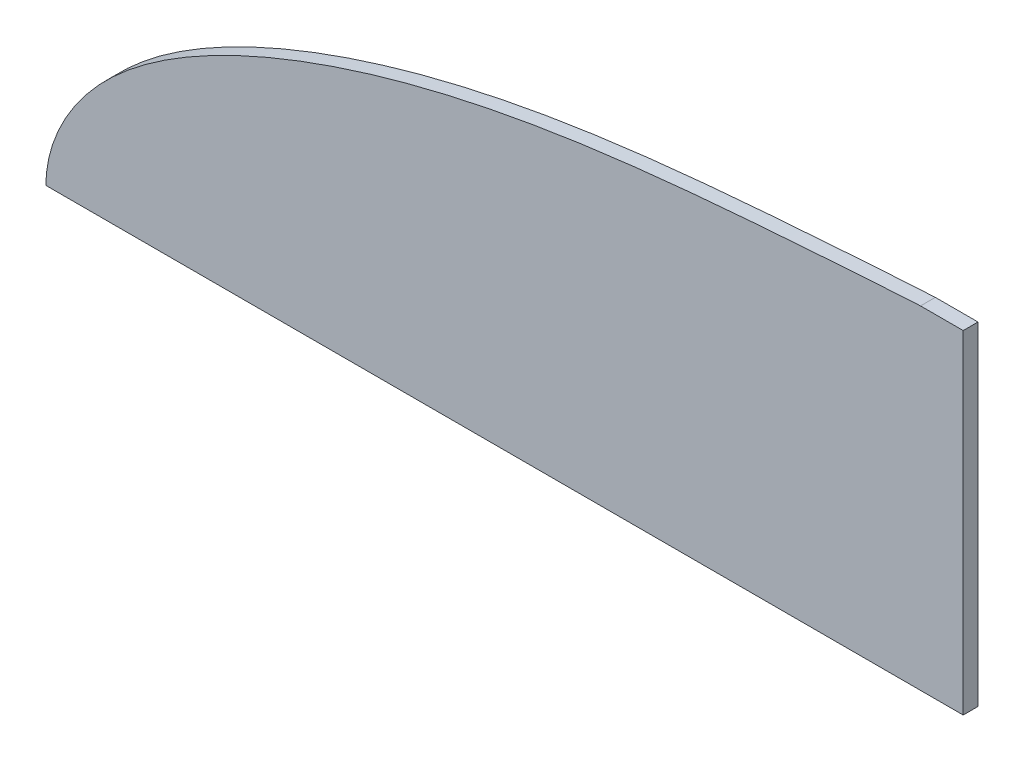
ISO-10303-21;
HEADER;
FILE_DESCRIPTION(('STEP AP214'),'2;1');
FILE_NAME('part.step','',(''),(''),'','','');
FILE_SCHEMA(('AUTOMOTIVE_DESIGN { 1 0 10303 214 1 1 1 1 }'));
ENDSEC;
DATA;
#1=APPLICATION_CONTEXT('core data for automotive mechanical design processes');
#2=APPLICATION_PROTOCOL_DEFINITION('international standard','automotive_design',2000,#1);
#3=PRODUCT_CONTEXT('',#1,'mechanical');
#4=PRODUCT('Part','Part','',(#3));
#5=PRODUCT_RELATED_PRODUCT_CATEGORY('part','',(#4));
#6=PRODUCT_DEFINITION_FORMATION('','',#4);
#7=PRODUCT_DEFINITION_CONTEXT('part definition',#1,'design');
#8=PRODUCT_DEFINITION('design','',#6,#7);
#9=PRODUCT_DEFINITION_SHAPE('','',#8);
#10=(LENGTH_UNIT() NAMED_UNIT(*) SI_UNIT(.MILLI.,.METRE.));
#11=(NAMED_UNIT(*) PLANE_ANGLE_UNIT() SI_UNIT($,.RADIAN.));
#12=(NAMED_UNIT(*) SI_UNIT($,.STERADIAN.) SOLID_ANGLE_UNIT());
#13=UNCERTAINTY_MEASURE_WITH_UNIT(LENGTH_MEASURE(1.E-05),#10,'distance_accuracy_value','');
#14=(GEOMETRIC_REPRESENTATION_CONTEXT(3) GLOBAL_UNCERTAINTY_ASSIGNED_CONTEXT((#13)) GLOBAL_UNIT_ASSIGNED_CONTEXT((#10,
#11,#12)) REPRESENTATION_CONTEXT('',''));
#15=CARTESIAN_POINT('',(0.,0.,0.));
#16=DIRECTION('',(0.,0.,1.));
#17=DIRECTION('',(1.,0.,0.));
#18=AXIS2_PLACEMENT_3D('',#15,#16,#17);
#19=CARTESIAN_POINT('',(564.347304180057,267.876320468831,12.));
#20=CARTESIAN_POINT('',(491.334761663846,264.54430428099,12.));
#21=CARTESIAN_POINT('',(355.098838341221,251.308924667235,12.));
#22=CARTESIAN_POINT('',(254.17906878634,251.308924667235,12.));
#23=CARTESIAN_POINT('',(151.604876779739,234.764700150042,12.));
#24=CARTESIAN_POINT('',(39.1041500628202,195.058561308777,12.));
#25=CARTESIAN_POINT('',(-49.4147483557301,153.698000015792,12.));
#26=CARTESIAN_POINT('',(-97.0813735028002,123.918395884844,12.));
#27=CARTESIAN_POINT('',(-131.301362464277,66.0136100746657,12.));
#28=CARTESIAN_POINT('',(-144.74799864987,31.2707385885588,12.));
#29=CARTESIAN_POINT('',(-144.74799864987,-2.1236795311767,12.));
#30=B_SPLINE_CURVE_WITH_KNOTS('',10,(#19,#20,#21,#22,#23,#24,#25,#26,#27,#28,#29),.UNSPECIFIED.,
.F.,.F.,(11,11),(0.,1.),.UNSPECIFIED.);
#31=DIRECTION('',(0.,0.,-1.));
#32=VECTOR('',#31,1.);
#33=SURFACE_OF_LINEAR_EXTRUSION('',#30,#32);
#34=CARTESIAN_POINT('',(564.347304180057,267.876320468831,0.));
#35=CARTESIAN_POINT('',(491.334761663846,264.54430428099,0.));
#36=CARTESIAN_POINT('',(355.098838341221,251.308924667235,0.));
#37=CARTESIAN_POINT('',(254.17906878634,251.308924667235,0.));
#38=CARTESIAN_POINT('',(151.604876779739,234.764700150042,0.));
#39=CARTESIAN_POINT('',(39.1041500628202,195.058561308777,0.));
#40=CARTESIAN_POINT('',(-49.4147483557301,153.698000015792,0.));
#41=CARTESIAN_POINT('',(-97.0813735028002,123.918395884844,0.));
#42=CARTESIAN_POINT('',(-131.301362464277,66.0136100746657,0.));
#43=CARTESIAN_POINT('',(-144.74799864987,31.2707385885588,0.));
#44=CARTESIAN_POINT('',(-144.74799864987,-2.1236795311767,0.));
#45=B_SPLINE_CURVE_WITH_KNOTS('',10,(#34,#35,#36,#37,#38,#39,#40,#41,#42,#43,#44),.UNSPECIFIED.,
.F.,.F.,(11,11),(0.,1.),.UNSPECIFIED.);
#46=CARTESIAN_POINT('',(564.347304180057,267.876320468831,0.));
#47=VERTEX_POINT('',#46);
#48=CARTESIAN_POINT('',(-144.74799864987,-2.1236795311767,0.));
#49=VERTEX_POINT('',#48);
#50=EDGE_CURVE('E95',#47,#49,#45,.T.);
#51=ORIENTED_EDGE('',*,*,#50,.T.);
#52=DIRECTION('',(0.,0.,-1.));
#53=VECTOR('',#52,1.);
#54=CARTESIAN_POINT('',(-144.74799864987,-2.1236795311767,12.));
#55=LINE('',#54,#53);
#56=CARTESIAN_POINT('',(-144.74799864987,-2.1236795311767,12.));
#57=VERTEX_POINT('',#56);
#58=EDGE_CURVE('E11',#57,#49,#55,.T.);
#59=ORIENTED_EDGE('',*,*,#58,.F.);
#60=CARTESIAN_POINT('',(564.347304180057,267.876320468831,12.));
#61=VERTEX_POINT('',#60);
#62=EDGE_CURVE('E84',#61,#57,#30,.T.);
#63=ORIENTED_EDGE('',*,*,#62,.F.);
#64=DIRECTION('',(0.,0.,-1.));
#65=VECTOR('',#64,1.);
#66=CARTESIAN_POINT('',(564.347304180057,267.876320468831,12.));
#67=LINE('',#66,#65);
#68=EDGE_CURVE('E92',#61,#47,#67,.T.);
#69=ORIENTED_EDGE('',*,*,#68,.T.);
#70=EDGE_LOOP('',(#51,#59,#63,#69));
#71=FACE_BOUND('',#70,.T.);
#72=ADVANCED_FACE('F32',(#71),#33,.F.);
#73=CARTESIAN_POINT('',(-49.4147483557275,-2.1236795311767,12.));
#74=DIRECTION('',(0.,1.,0.));
#75=DIRECTION('',(0.,0.,1.));
#76=AXIS2_PLACEMENT_3D('',#73,#74,#75);
#77=PLANE('',#76);
#78=DIRECTION('',(1.,0.,0.));
#79=VECTOR('',#78,1.);
#80=CARTESIAN_POINT('',(-49.4147483557275,-2.1236795311767,0.));
#81=LINE('',#80,#79);
#82=CARTESIAN_POINT('',(598.934980700249,-2.1236795311767,0.));
#83=VERTEX_POINT('',#82);
#84=EDGE_CURVE('E88',#49,#83,#81,.T.);
#85=ORIENTED_EDGE('',*,*,#84,.T.);
#86=DIRECTION('',(0.,0.,-1.));
#87=VECTOR('',#86,1.);
#88=CARTESIAN_POINT('',(598.934980700249,-2.1236795311767,12.));
#89=LINE('',#88,#87);
#90=CARTESIAN_POINT('',(598.934980700249,-2.1236795311767,12.));
#91=VERTEX_POINT('',#90);
#92=EDGE_CURVE('E41',#91,#83,#89,.T.);
#93=ORIENTED_EDGE('',*,*,#92,.F.);
#94=DIRECTION('',(1.,0.,0.));
#95=VECTOR('',#94,1.);
#96=CARTESIAN_POINT('',(-144.74799864987,-2.1236795311767,12.));
#97=LINE('',#96,#95);
#98=EDGE_CURVE('E79',#57,#91,#97,.T.);
#99=ORIENTED_EDGE('',*,*,#98,.F.);
#100=ORIENTED_EDGE('',*,*,#58,.T.);
#101=EDGE_LOOP('',(#85,#93,#99,#100));
#102=FACE_BOUND('',#101,.T.);
#103=ADVANCED_FACE('F87',(#102),#77,.F.);
#104=CARTESIAN_POINT('',(598.934980700249,267.876320468831,12.));
#105=DIRECTION('',(-1.,0.,0.));
#106=DIRECTION('',(0.,0.,1.));
#107=AXIS2_PLACEMENT_3D('',#104,#105,#106);
#108=PLANE('',#107);
#109=DIRECTION('',(0.,1.,0.));
#110=VECTOR('',#109,1.);
#111=CARTESIAN_POINT('',(598.934980700249,267.876320468831,0.));
#112=LINE('',#111,#110);
#113=CARTESIAN_POINT('',(598.934980700249,267.876320468831,0.));
#114=VERTEX_POINT('',#113);
#115=EDGE_CURVE('E66',#83,#114,#112,.T.);
#116=ORIENTED_EDGE('',*,*,#115,.T.);
#117=DIRECTION('',(0.,0.,-1.));
#118=VECTOR('',#117,1.);
#119=CARTESIAN_POINT('',(598.934980700249,267.876320468831,12.));
#120=LINE('',#119,#118);
#121=CARTESIAN_POINT('',(598.934980700249,267.876320468831,12.));
#122=VERTEX_POINT('',#121);
#123=EDGE_CURVE('E89',#122,#114,#120,.T.);
#124=ORIENTED_EDGE('',*,*,#123,.F.);
#125=DIRECTION('',(0.,1.,0.));
#126=VECTOR('',#125,1.);
#127=CARTESIAN_POINT('',(598.934980700249,267.876320468831,12.));
#128=LINE('',#127,#126);
#129=EDGE_CURVE('E82',#91,#122,#128,.T.);
#130=ORIENTED_EDGE('',*,*,#129,.F.);
#131=ORIENTED_EDGE('',*,*,#92,.T.);
#132=EDGE_LOOP('',(#116,#124,#130,#131));
#133=FACE_BOUND('',#132,.T.);
#134=ADVANCED_FACE('F90',(#133),#108,.F.);
#135=CARTESIAN_POINT('',(564.347304180057,267.876320468831,12.));
#136=DIRECTION('',(0.,-1.,0.));
#137=DIRECTION('',(0.,0.,-1.));
#138=AXIS2_PLACEMENT_3D('',#135,#136,#137);
#139=PLANE('',#138);
#140=DIRECTION('',(-1.,0.,0.));
#141=VECTOR('',#140,1.);
#142=CARTESIAN_POINT('',(564.347304180057,267.876320468831,0.));
#143=LINE('',#142,#141);
#144=EDGE_CURVE('E72',#114,#47,#143,.T.);
#145=ORIENTED_EDGE('',*,*,#144,.T.);
#146=ORIENTED_EDGE('',*,*,#68,.F.);
#147=DIRECTION('',(-1.,0.,0.));
#148=VECTOR('',#147,1.);
#149=CARTESIAN_POINT('',(564.347304180057,267.876320468831,12.));
#150=LINE('',#149,#148);
#151=EDGE_CURVE('E49',#122,#61,#150,.T.);
#152=ORIENTED_EDGE('',*,*,#151,.F.);
#153=ORIENTED_EDGE('',*,*,#123,.T.);
#154=EDGE_LOOP('',(#145,#146,#152,#153));
#155=FACE_BOUND('',#154,.T.);
#156=ADVANCED_FACE('F107',(#155),#139,.F.);
#157=CARTESIAN_POINT('',(62.6193843447555,188.733027425688,12.));
#158=DIRECTION('',(0.,0.,1.));
#159=DIRECTION('',(1.,0.,0.));
#160=AXIS2_PLACEMENT_3D('',#157,#158,#159);
#161=PLANE('',#160);
#162=ORIENTED_EDGE('',*,*,#62,.T.);
#163=ORIENTED_EDGE('',*,*,#98,.T.);
#164=ORIENTED_EDGE('',*,*,#129,.T.);
#165=ORIENTED_EDGE('',*,*,#151,.T.);
#166=EDGE_LOOP('',(#162,#163,#164,#165));
#167=FACE_BOUND('',#166,.T.);
#168=ADVANCED_FACE('F80',(#167),#161,.T.);
#169=CARTESIAN_POINT('',(62.6193843447555,188.733027425688,0.));
#170=DIRECTION('',(0.,0.,1.));
#171=DIRECTION('',(1.,0.,0.));
#172=AXIS2_PLACEMENT_3D('',#169,#170,#171);
#173=PLANE('',#172);
#174=ORIENTED_EDGE('',*,*,#50,.F.);
#175=ORIENTED_EDGE('',*,*,#144,.F.);
#176=ORIENTED_EDGE('',*,*,#115,.F.);
#177=ORIENTED_EDGE('',*,*,#84,.F.);
#178=EDGE_LOOP('',(#174,#175,#176,#177));
#179=FACE_BOUND('',#178,.T.);
#180=ADVANCED_FACE('F110',(#179),#173,.F.);
#181=CLOSED_SHELL('',(#72,#103,#134,#156,#168,#180));
#182=MANIFOLD_SOLID_BREP('B2',#181);
#183=ADVANCED_BREP_SHAPE_REPRESENTATION('',(#18,#182),#14);
#184=SHAPE_DEFINITION_REPRESENTATION(#9,#183);
ENDSEC;
END-ISO-10303-21;
